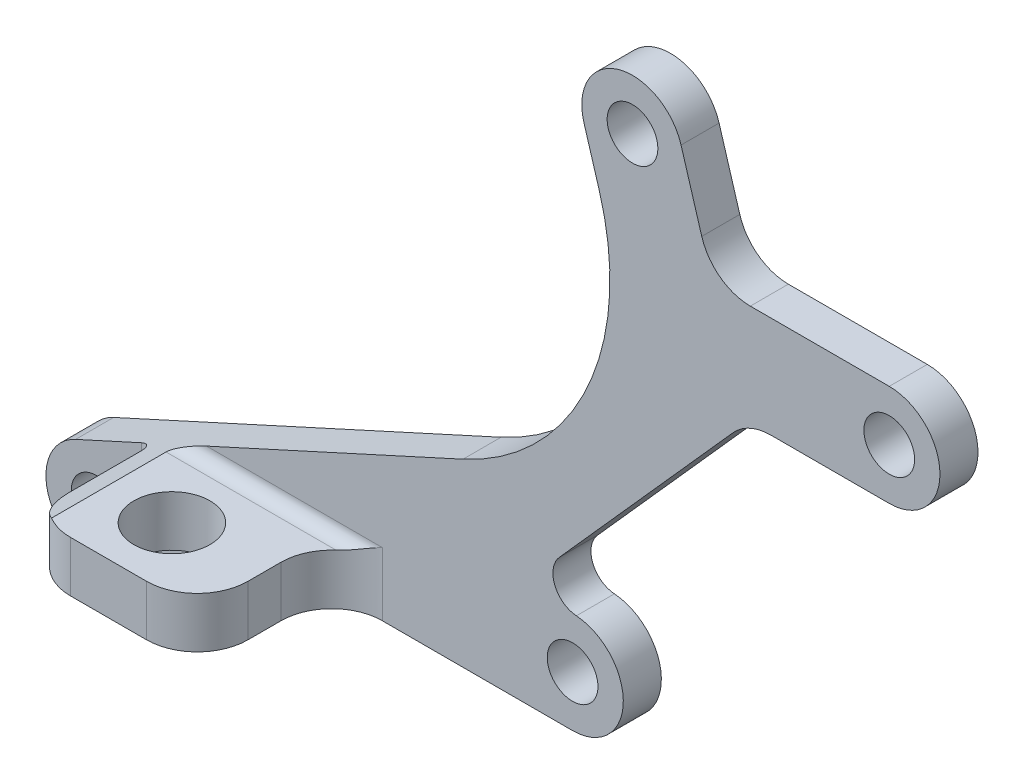
ISO-10303-21;
HEADER;
FILE_DESCRIPTION(('STEP AP214'),'2;1');
FILE_NAME('part.step','',(''),(''),'','','');
FILE_SCHEMA(('AUTOMOTIVE_DESIGN { 1 0 10303 214 1 1 1 1 }'));
ENDSEC;
DATA;
#1=APPLICATION_CONTEXT('core data for automotive mechanical design processes');
#2=APPLICATION_PROTOCOL_DEFINITION('international standard','automotive_design',2000,#1);
#3=PRODUCT_CONTEXT('',#1,'mechanical');
#4=PRODUCT('Part','Part','',(#3));
#5=PRODUCT_RELATED_PRODUCT_CATEGORY('part','',(#4));
#6=PRODUCT_DEFINITION_FORMATION('','',#4);
#7=PRODUCT_DEFINITION_CONTEXT('part definition',#1,'design');
#8=PRODUCT_DEFINITION('design','',#6,#7);
#9=PRODUCT_DEFINITION_SHAPE('','',#8);
#10=(LENGTH_UNIT() NAMED_UNIT(*) SI_UNIT(.MILLI.,.METRE.));
#11=(NAMED_UNIT(*) PLANE_ANGLE_UNIT() SI_UNIT($,.RADIAN.));
#12=(NAMED_UNIT(*) SI_UNIT($,.STERADIAN.) SOLID_ANGLE_UNIT());
#13=UNCERTAINTY_MEASURE_WITH_UNIT(LENGTH_MEASURE(1.E-05),#10,'distance_accuracy_value','');
#14=(GEOMETRIC_REPRESENTATION_CONTEXT(3) GLOBAL_UNCERTAINTY_ASSIGNED_CONTEXT((#13)) GLOBAL_UNIT_ASSIGNED_CONTEXT((#10,
#11,#12)) REPRESENTATION_CONTEXT('',''));
#15=CARTESIAN_POINT('',(0.,0.,0.));
#16=DIRECTION('',(0.,0.,1.));
#17=DIRECTION('',(1.,0.,0.));
#18=AXIS2_PLACEMENT_3D('',#15,#16,#17);
#19=CARTESIAN_POINT('',(15.9999999876103,2.00058899142973,1.5));
#20=DIRECTION('',(0.,0.,1.));
#21=DIRECTION('',(1.,0.,0.));
#22=AXIS2_PLACEMENT_3D('',#19,#20,#21);
#23=PLANE('',#22);
#24=DIRECTION('',(-1.,0.,0.));
#25=VECTOR('',#24,1.);
#26=CARTESIAN_POINT('',(6.49999998761032,2.5,1.5));
#27=LINE('',#26,#25);
#28=CARTESIAN_POINT('',(1.56588374498278,2.5,1.5));
#29=VERTEX_POINT('',#28);
#30=CARTESIAN_POINT('',(8.49999998761032,2.5,1.5));
#31=VERTEX_POINT('',#30);
#32=EDGE_CURVE('E345',#29,#31,#27,.F.);
#33=ORIENTED_EDGE('',*,*,#32,.T.);
#34=DIRECTION('',(0.,1.,0.));
#35=VECTOR('',#34,1.);
#36=CARTESIAN_POINT('',(8.49999998761032,0.,1.5));
#37=LINE('',#36,#35);
#38=CARTESIAN_POINT('',(8.49999998761032,0.,1.5));
#39=VERTEX_POINT('',#38);
#40=EDGE_CURVE('E361',#31,#39,#37,.F.);
#41=ORIENTED_EDGE('',*,*,#40,.T.);
#42=DIRECTION('',(1.,0.,0.));
#43=VECTOR('',#42,1.);
#44=CARTESIAN_POINT('',(5.72587492170305,0.,1.5));
#45=LINE('',#44,#43);
#46=CARTESIAN_POINT('',(15.9999999876103,0.,1.5));
#47=VERTEX_POINT('',#46);
#48=EDGE_CURVE('E291',#39,#47,#45,.T.);
#49=ORIENTED_EDGE('',*,*,#48,.T.);
#50=CARTESIAN_POINT('',(15.9999999876103,2.00058899142973,1.5));
#51=DIRECTION('',(0.,0.,1.));
#52=DIRECTION('',(1.,0.,0.));
#53=AXIS2_PLACEMENT_3D('',#50,#51,#52);
#54=CIRCLE('',#53,2.00058899142973);
#55=CARTESIAN_POINT('',(16.1495989013334,3.99557683040087,1.5));
#56=VERTEX_POINT('',#55);
#57=EDGE_CURVE('E278',#47,#56,#54,.T.);
#58=ORIENTED_EDGE('',*,*,#57,.T.);
#59=CARTESIAN_POINT('',(16.2243763365607,4.99277707868645,1.5));
#60=DIRECTION('',(0.,0.,1.));
#61=DIRECTION('',(1.,0.,0.));
#62=AXIS2_PLACEMENT_3D('',#59,#60,#61);
#63=CIRCLE('',#62,1.);
#64=CARTESIAN_POINT('',(15.4780865704061,5.65839828097267,1.5));
#65=VERTEX_POINT('',#64);
#66=EDGE_CURVE('E342',#56,#65,#63,.F.);
#67=ORIENTED_EDGE('',*,*,#66,.T.);
#68=DIRECTION('',(0.66562120228622,0.746289766154572,0.));
#69=VECTOR('',#68,1.);
#70=CARTESIAN_POINT('',(13.9999998843631,4.00117798285946,1.5));
#71=LINE('',#70,#69);
#72=CARTESIAN_POINT('',(22.3226020019824,13.3324203874319,1.5));
#73=VERTEX_POINT('',#72);
#74=EDGE_CURVE('E282',#65,#73,#71,.T.);
#75=ORIENTED_EDGE('',*,*,#74,.T.);
#76=CARTESIAN_POINT('',(23.8151815342915,12.0011779828595,1.5));
#77=DIRECTION('',(0.,0.,1.));
#78=DIRECTION('',(1.,0.,0.));
#79=AXIS2_PLACEMENT_3D('',#76,#77,#78);
#80=CIRCLE('',#79,2.);
#81=CARTESIAN_POINT('',(23.8151815342915,14.0011779828595,1.5));
#82=VERTEX_POINT('',#81);
#83=EDGE_CURVE('E329',#73,#82,#80,.F.);
#84=ORIENTED_EDGE('',*,*,#83,.T.);
#85=DIRECTION('',(1.,0.,0.));
#86=VECTOR('',#85,1.);
#87=CARTESIAN_POINT('',(22.9190717043612,14.0011779828595,1.5));
#88=LINE('',#87,#86);
#89=CARTESIAN_POINT('',(28.487225861294,14.0011779828595,1.5));
#90=VERTEX_POINT('',#89);
#91=EDGE_CURVE('E482',#82,#90,#88,.T.);
#92=ORIENTED_EDGE('',*,*,#91,.T.);
#93=CARTESIAN_POINT('',(28.487225861294,16.0011779828595,1.5));
#94=DIRECTION('',(0.,0.,1.));
#95=DIRECTION('',(1.,0.,0.));
#96=AXIS2_PLACEMENT_3D('',#93,#94,#95);
#97=CIRCLE('',#96,2.);
#98=CARTESIAN_POINT('',(28.487225861294,18.0011779828595,1.5));
#99=VERTEX_POINT('',#98);
#100=EDGE_CURVE('E484',#90,#99,#97,.T.);
#101=ORIENTED_EDGE('',*,*,#100,.T.);
#102=DIRECTION('',(-1.,0.,0.));
#103=VECTOR('',#102,1.);
#104=CARTESIAN_POINT('',(28.487225861294,18.0011779828595,1.5));
#105=LINE('',#104,#103);
#106=CARTESIAN_POINT('',(23.0090000463873,18.0011779828595,1.5));
#107=VERTEX_POINT('',#106);
#108=EDGE_CURVE('E489',#99,#107,#105,.T.);
#109=ORIENTED_EDGE('',*,*,#108,.T.);
#110=CARTESIAN_POINT('',(23.0090000463873,20.0011779828595,1.5));
#111=DIRECTION('',(0.,0.,1.));
#112=DIRECTION('',(1.,0.,0.));
#113=AXIS2_PLACEMENT_3D('',#110,#111,#112);
#114=CIRCLE('',#113,2.);
#115=CARTESIAN_POINT('',(21.093764126648,19.425095200839,1.5));
#116=VERTEX_POINT('',#115);
#117=EDGE_CURVE('E333',#107,#116,#114,.F.);
#118=ORIENTED_EDGE('',*,*,#117,.T.);
#119=DIRECTION('',(-0.288041391010258,0.957617959869632,0.));
#120=VECTOR('',#119,1.);
#121=CARTESIAN_POINT('',(20.2779497060594,22.1373392236034,1.5));
#122=LINE('',#121,#120);
#123=CARTESIAN_POINT('',(20.2779497060594,22.1373392236034,1.5));
#124=VERTEX_POINT('',#123);
#125=EDGE_CURVE('E492',#116,#124,#122,.T.);
#126=ORIENTED_EDGE('',*,*,#125,.T.);
#127=CARTESIAN_POINT('',(18.3627137863201,21.5612564415828,1.5));
#128=DIRECTION('',(0.,0.,1.));
#129=DIRECTION('',(1.,0.,0.));
#130=AXIS2_PLACEMENT_3D('',#127,#128,#129);
#131=CIRCLE('',#130,2.);
#132=CARTESIAN_POINT('',(16.4474778665809,20.9851736595623,1.5));
#133=VERTEX_POINT('',#132);
#134=EDGE_CURVE('E494',#124,#133,#131,.T.);
#135=ORIENTED_EDGE('',*,*,#134,.T.);
#136=DIRECTION('',(0.288041391010258,-0.957617959869632,0.));
#137=VECTOR('',#136,1.);
#138=CARTESIAN_POINT('',(17.0539428486444,18.968929546801,1.5));
#139=LINE('',#138,#137);
#140=CARTESIAN_POINT('',(17.0539428486444,18.968929546801,1.5));
#141=VERTEX_POINT('',#140);
#142=EDGE_CURVE('E496',#133,#141,#139,.T.);
#143=ORIENTED_EDGE('',*,*,#142,.T.);
#144=CARTESIAN_POINT('',(7.57352504593501,16.1173197757994,1.5));
#145=DIRECTION('',(0.,0.,-1.));
#146=DIRECTION('',(1.,0.,0.));
#147=AXIS2_PLACEMENT_3D('',#144,#145,#146);
#148=CIRCLE('',#147,9.9);
#149=CARTESIAN_POINT('',(11.678911431911,7.10866823287454,1.5));
#150=VERTEX_POINT('',#149);
#151=EDGE_CURVE('E498',#141,#150,#148,.T.);
#152=ORIENTED_EDGE('',*,*,#151,.T.);
#153=DIRECTION('',(-0.909964802315643,-0.414685493532933,0.));
#154=VECTOR('',#153,1.);
#155=CARTESIAN_POINT('',(-3.5973418353976,0.147035640748656,1.5));
#156=LINE('',#155,#154);
#157=EDGE_CURVE('E501',#150,#29,#156,.T.);
#158=ORIENTED_EDGE('',*,*,#157,.T.);
#159=EDGE_LOOP('',(#33,#41,#49,#58,#67,#75,#84,#92,#101,#109,#118,#126,#135,#143,#152,#158));
#160=FACE_BOUND('',#159,.T.);
#161=CARTESIAN_POINT('',(18.3627137863201,21.5612564415828,1.5));
#162=DIRECTION('',(0.,0.,1.));
#163=DIRECTION('',(1.,0.,0.));
#164=AXIS2_PLACEMENT_3D('',#161,#162,#163);
#165=CIRCLE('',#164,1.);
#166=CARTESIAN_POINT('',(19.3627137863201,21.5612564415828,1.5));
#167=VERTEX_POINT('',#166);
#168=EDGE_CURVE('E581',#167,#167,#165,.T.);
#169=ORIENTED_EDGE('',*,*,#168,.F.);
#170=EDGE_LOOP('',(#169));
#171=FACE_BOUND('',#170,.T.);
#172=CARTESIAN_POINT('',(28.487225861294,16.0011779828595,1.5));
#173=DIRECTION('',(0.,0.,1.));
#174=DIRECTION('',(1.,0.,0.));
#175=AXIS2_PLACEMENT_3D('',#172,#173,#174);
#176=CIRCLE('',#175,1.);
#177=CARTESIAN_POINT('',(29.487225861294,16.0011779828595,1.5));
#178=VERTEX_POINT('',#177);
#179=EDGE_CURVE('E593',#178,#178,#176,.T.);
#180=ORIENTED_EDGE('',*,*,#179,.F.);
#181=EDGE_LOOP('',(#180));
#182=FACE_BOUND('',#181,.T.);
#183=CARTESIAN_POINT('',(15.9999999876103,2.00058899142973,1.5));
#184=DIRECTION('',(0.,0.,1.));
#185=DIRECTION('',(1.,0.,0.));
#186=AXIS2_PLACEMENT_3D('',#183,#184,#185);
#187=CIRCLE('',#186,1.);
#188=CARTESIAN_POINT('',(16.9999999876103,2.00058899142973,1.5));
#189=VERTEX_POINT('',#188);
#190=EDGE_CURVE('E587',#189,#189,#187,.T.);
#191=ORIENTED_EDGE('',*,*,#190,.F.);
#192=EDGE_LOOP('',(#191));
#193=FACE_BOUND('',#192,.T.);
#194=ADVANCED_FACE('F33',(#160,#171,#182,#193),#23,.T.);
#195=DIRECTION('',(1.,0.,0.));
#196=VECTOR('',#195,1.);
#197=CARTESIAN_POINT('',(15.9999999876103,0.,1.5));
#198=LINE('',#197,#196);
#199=CARTESIAN_POINT('',(-1.00000001238968,0.,1.5));
#200=VERTEX_POINT('',#199);
#201=CARTESIAN_POINT('',(6.81145904615961,0.,1.5));
#202=VERTEX_POINT('',#201);
#203=EDGE_CURVE('E260',#200,#202,#198,.T.);
#204=ORIENTED_EDGE('',*,*,#203,.F.);
#205=DIRECTION('',(0.,-1.,0.));
#206=VECTOR('',#205,1.);
#207=CARTESIAN_POINT('',(-1.00000001238968,1.55854377737733,1.5));
#208=LINE('',#207,#206);
#209=CARTESIAN_POINT('',(-1.00000001238968,1.33068579183896,1.5));
#210=VERTEX_POINT('',#209);
#211=EDGE_CURVE('E352',#200,#210,#208,.F.);
#212=ORIENTED_EDGE('',*,*,#211,.T.);
#213=CARTESIAN_POINT('',(-3.5973418353976,0.147035640748653,1.5));
#214=VERTEX_POINT('',#213);
#215=EDGE_CURVE('E500',#210,#214,#156,.T.);
#216=ORIENTED_EDGE('',*,*,#215,.T.);
#217=CARTESIAN_POINT('',(-2.76797084833173,-1.67289396388264,1.5));
#218=DIRECTION('',(0.,0.,1.));
#219=DIRECTION('',(1.,0.,0.));
#220=AXIS2_PLACEMENT_3D('',#217,#218,#219);
#221=CIRCLE('',#220,2.);
#222=CARTESIAN_POINT('',(-1.93859986126587,-3.49282356851392,1.5));
#223=VERTEX_POINT('',#222);
#224=EDGE_CURVE('E504',#214,#223,#221,.T.);
#225=ORIENTED_EDGE('',*,*,#224,.T.);
#226=DIRECTION('',(0.909964802315643,0.414685493532933,0.));
#227=VECTOR('',#226,1.);
#228=CARTESIAN_POINT('',(-1.93859986126587,-3.49282356851392,1.5));
#229=LINE('',#228,#227);
#230=CARTESIAN_POINT('',(4.73803157849494,-0.450175988421784,1.5));
#231=VERTEX_POINT('',#230);
#232=EDGE_CURVE('E262',#223,#231,#229,.T.);
#233=ORIENTED_EDGE('',*,*,#232,.T.);
#234=CARTESIAN_POINT('',(6.81145904615961,-5.,1.5));
#235=DIRECTION('',(0.,0.,1.));
#236=DIRECTION('',(1.,0.,0.));
#237=AXIS2_PLACEMENT_3D('',#234,#235,#236);
#238=CIRCLE('',#237,5.);
#239=EDGE_CURVE('E41',#231,#202,#238,.F.);
#240=ORIENTED_EDGE('',*,*,#239,.T.);
#241=EDGE_LOOP('',(#204,#212,#216,#225,#233,#240));
#242=FACE_BOUND('',#241,.T.);
#243=CARTESIAN_POINT('',(-2.76797084833173,-1.67289396388264,1.5));
#244=DIRECTION('',(0.,0.,1.));
#245=DIRECTION('',(1.,0.,0.));
#246=AXIS2_PLACEMENT_3D('',#243,#244,#245);
#247=CIRCLE('',#246,1.);
#248=CARTESIAN_POINT('',(-1.76797084833173,-1.67289396388264,1.5));
#249=VERTEX_POINT('',#248);
#250=EDGE_CURVE('E510',#249,#249,#247,.T.);
#251=ORIENTED_EDGE('',*,*,#250,.F.);
#252=EDGE_LOOP('',(#251));
#253=FACE_BOUND('',#252,.T.);
#254=ADVANCED_FACE('F258',(#242,#253),#23,.T.);
#255=CARTESIAN_POINT('',(15.9999999876103,2.00058899142973,0.));
#256=DIRECTION('',(0.,0.,1.));
#257=DIRECTION('',(1.,0.,0.));
#258=AXIS2_PLACEMENT_3D('',#255,#256,#257);
#259=PLANE('',#258);
#260=CARTESIAN_POINT('',(-2.76797084833173,-1.67289396388264,0.));
#261=DIRECTION('',(0.,0.,1.));
#262=DIRECTION('',(1.,0.,0.));
#263=AXIS2_PLACEMENT_3D('',#260,#261,#262);
#264=CIRCLE('',#263,2.);
#265=CARTESIAN_POINT('',(-3.5973418353976,0.147035640748653,0.));
#266=VERTEX_POINT('',#265);
#267=CARTESIAN_POINT('',(-1.93859986126587,-3.49282356851392,0.));
#268=VERTEX_POINT('',#267);
#269=EDGE_CURVE('E284',#266,#268,#264,.T.);
#270=ORIENTED_EDGE('',*,*,#269,.F.);
#271=DIRECTION('',(-0.909964802315643,-0.414685493532933,0.));
#272=VECTOR('',#271,1.);
#273=CARTESIAN_POINT('',(-3.5973418353976,0.147035640748656,0.));
#274=LINE('',#273,#272);
#275=CARTESIAN_POINT('',(11.678911431911,7.10866823287454,0.));
#276=VERTEX_POINT('',#275);
#277=EDGE_CURVE('E527',#276,#266,#274,.T.);
#278=ORIENTED_EDGE('',*,*,#277,.F.);
#279=CARTESIAN_POINT('',(7.57352504593501,16.1173197757994,0.));
#280=DIRECTION('',(0.,0.,-1.));
#281=DIRECTION('',(1.,0.,0.));
#282=AXIS2_PLACEMENT_3D('',#279,#280,#281);
#283=CIRCLE('',#282,9.9);
#284=CARTESIAN_POINT('',(17.0539428486444,18.968929546801,0.));
#285=VERTEX_POINT('',#284);
#286=EDGE_CURVE('E525',#285,#276,#283,.T.);
#287=ORIENTED_EDGE('',*,*,#286,.F.);
#288=DIRECTION('',(0.288041391010258,-0.957617959869632,0.));
#289=VECTOR('',#288,1.);
#290=CARTESIAN_POINT('',(17.0539428486444,18.968929546801,0.));
#291=LINE('',#290,#289);
#292=CARTESIAN_POINT('',(16.4474778665809,20.9851736595623,0.));
#293=VERTEX_POINT('',#292);
#294=EDGE_CURVE('E523',#293,#285,#291,.T.);
#295=ORIENTED_EDGE('',*,*,#294,.F.);
#296=CARTESIAN_POINT('',(18.3627137863201,21.5612564415828,0.));
#297=DIRECTION('',(0.,0.,1.));
#298=DIRECTION('',(1.,0.,0.));
#299=AXIS2_PLACEMENT_3D('',#296,#297,#298);
#300=CIRCLE('',#299,2.);
#301=CARTESIAN_POINT('',(20.2779497060594,22.1373392236034,0.));
#302=VERTEX_POINT('',#301);
#303=EDGE_CURVE('E521',#302,#293,#300,.T.);
#304=ORIENTED_EDGE('',*,*,#303,.F.);
#305=DIRECTION('',(-0.288041391010258,0.957617959869632,0.));
#306=VECTOR('',#305,1.);
#307=CARTESIAN_POINT('',(20.2779497060594,22.1373392236034,0.));
#308=LINE('',#307,#306);
#309=CARTESIAN_POINT('',(21.093764126648,19.425095200839,0.));
#310=VERTEX_POINT('',#309);
#311=EDGE_CURVE('E519',#310,#302,#308,.T.);
#312=ORIENTED_EDGE('',*,*,#311,.F.);
#313=CARTESIAN_POINT('',(23.0090000463873,20.0011779828595,0.));
#314=DIRECTION('',(0.,0.,1.));
#315=DIRECTION('',(1.,0.,0.));
#316=AXIS2_PLACEMENT_3D('',#313,#314,#315);
#317=CIRCLE('',#316,2.);
#318=CARTESIAN_POINT('',(23.0090000463873,18.0011779828595,0.));
#319=VERTEX_POINT('',#318);
#320=EDGE_CURVE('E331',#310,#319,#317,.T.);
#321=ORIENTED_EDGE('',*,*,#320,.T.);
#322=DIRECTION('',(-1.,0.,0.));
#323=VECTOR('',#322,1.);
#324=CARTESIAN_POINT('',(28.487225861294,18.0011779828595,0.));
#325=LINE('',#324,#323);
#326=CARTESIAN_POINT('',(28.487225861294,18.0011779828595,0.));
#327=VERTEX_POINT('',#326);
#328=EDGE_CURVE('E516',#327,#319,#325,.T.);
#329=ORIENTED_EDGE('',*,*,#328,.F.);
#330=CARTESIAN_POINT('',(28.487225861294,16.0011779828595,0.));
#331=DIRECTION('',(0.,0.,1.));
#332=DIRECTION('',(1.,0.,0.));
#333=AXIS2_PLACEMENT_3D('',#330,#331,#332);
#334=CIRCLE('',#333,2.);
#335=CARTESIAN_POINT('',(28.487225861294,14.0011779828595,0.));
#336=VERTEX_POINT('',#335);
#337=EDGE_CURVE('E514',#336,#327,#334,.T.);
#338=ORIENTED_EDGE('',*,*,#337,.F.);
#339=DIRECTION('',(1.,0.,0.));
#340=VECTOR('',#339,1.);
#341=CARTESIAN_POINT('',(22.9190717043612,14.0011779828595,0.));
#342=LINE('',#341,#340);
#343=CARTESIAN_POINT('',(23.8151815342915,14.0011779828595,0.));
#344=VERTEX_POINT('',#343);
#345=EDGE_CURVE('E512',#344,#336,#342,.T.);
#346=ORIENTED_EDGE('',*,*,#345,.F.);
#347=CARTESIAN_POINT('',(23.8151815342915,12.0011779828595,0.));
#348=DIRECTION('',(0.,0.,1.));
#349=DIRECTION('',(1.,0.,0.));
#350=AXIS2_PLACEMENT_3D('',#347,#348,#349);
#351=CIRCLE('',#350,2.);
#352=CARTESIAN_POINT('',(22.3226020019824,13.3324203874319,0.));
#353=VERTEX_POINT('',#352);
#354=EDGE_CURVE('E326',#344,#353,#351,.T.);
#355=ORIENTED_EDGE('',*,*,#354,.T.);
#356=DIRECTION('',(0.66562120228622,0.746289766154572,0.));
#357=VECTOR('',#356,1.);
#358=CARTESIAN_POINT('',(13.9999998843631,4.00117798285946,0.));
#359=LINE('',#358,#357);
#360=CARTESIAN_POINT('',(15.4780865704061,5.65839828097267,0.));
#361=VERTEX_POINT('',#360);
#362=EDGE_CURVE('E509',#361,#353,#359,.T.);
#363=ORIENTED_EDGE('',*,*,#362,.F.);
#364=CARTESIAN_POINT('',(16.2243763365607,4.99277707868645,0.));
#365=DIRECTION('',(0.,0.,1.));
#366=DIRECTION('',(1.,0.,0.));
#367=AXIS2_PLACEMENT_3D('',#364,#365,#366);
#368=CIRCLE('',#367,1.);
#369=CARTESIAN_POINT('',(16.1495989013334,3.99557683040087,0.));
#370=VERTEX_POINT('',#369);
#371=EDGE_CURVE('E340',#361,#370,#368,.T.);
#372=ORIENTED_EDGE('',*,*,#371,.T.);
#373=CARTESIAN_POINT('',(15.9999999876103,2.00058899142973,0.));
#374=DIRECTION('',(0.,0.,1.));
#375=DIRECTION('',(1.,0.,0.));
#376=AXIS2_PLACEMENT_3D('',#373,#374,#375);
#377=CIRCLE('',#376,2.00058899142973);
#378=CARTESIAN_POINT('',(15.9999999876103,0.,0.));
#379=VERTEX_POINT('',#378);
#380=EDGE_CURVE('E277',#379,#370,#377,.T.);
#381=ORIENTED_EDGE('',*,*,#380,.F.);
#382=DIRECTION('',(1.,0.,0.));
#383=VECTOR('',#382,1.);
#384=CARTESIAN_POINT('',(5.72587492170305,0.,0.));
#385=LINE('',#384,#383);
#386=CARTESIAN_POINT('',(6.81145904615961,0.,0.));
#387=VERTEX_POINT('',#386);
#388=EDGE_CURVE('E268',#387,#379,#385,.T.);
#389=ORIENTED_EDGE('',*,*,#388,.F.);
#390=CARTESIAN_POINT('',(6.81145904615961,-5.,0.));
#391=DIRECTION('',(0.,0.,1.));
#392=DIRECTION('',(1.,0.,0.));
#393=AXIS2_PLACEMENT_3D('',#390,#391,#392);
#394=CIRCLE('',#393,5.);
#395=CARTESIAN_POINT('',(4.73803157849494,-0.450175988421784,0.));
#396=VERTEX_POINT('',#395);
#397=EDGE_CURVE('E253',#387,#396,#394,.T.);
#398=ORIENTED_EDGE('',*,*,#397,.T.);
#399=DIRECTION('',(0.909964802315643,0.414685493532933,0.));
#400=VECTOR('',#399,1.);
#401=CARTESIAN_POINT('',(-1.93859986126587,-3.49282356851392,0.));
#402=LINE('',#401,#400);
#403=EDGE_CURVE('E279',#268,#396,#402,.T.);
#404=ORIENTED_EDGE('',*,*,#403,.F.);
#405=EDGE_LOOP('',(#270,#278,#287,#295,#304,#312,#321,#329,#338,#346,#355,#363,#372,#381,#389,
#398,#404));
#406=FACE_BOUND('',#405,.T.);
#407=CARTESIAN_POINT('',(-2.76797084833173,-1.67289396388264,0.));
#408=DIRECTION('',(0.,0.,1.));
#409=DIRECTION('',(1.,0.,0.));
#410=AXIS2_PLACEMENT_3D('',#407,#408,#409);
#411=CIRCLE('',#410,1.);
#412=CARTESIAN_POINT('',(-1.76797084833173,-1.67289396388264,0.));
#413=VERTEX_POINT('',#412);
#414=EDGE_CURVE('E596',#413,#413,#411,.T.);
#415=ORIENTED_EDGE('',*,*,#414,.T.);
#416=EDGE_LOOP('',(#415));
#417=FACE_BOUND('',#416,.T.);
#418=CARTESIAN_POINT('',(18.3627137863201,21.5612564415828,0.));
#419=DIRECTION('',(0.,0.,1.));
#420=DIRECTION('',(1.,0.,0.));
#421=AXIS2_PLACEMENT_3D('',#418,#419,#420);
#422=CIRCLE('',#421,1.);
#423=CARTESIAN_POINT('',(19.3627137863201,21.5612564415828,0.));
#424=VERTEX_POINT('',#423);
#425=EDGE_CURVE('E580',#424,#424,#422,.T.);
#426=ORIENTED_EDGE('',*,*,#425,.T.);
#427=EDGE_LOOP('',(#426));
#428=FACE_BOUND('',#427,.T.);
#429=CARTESIAN_POINT('',(15.9999999876103,2.00058899142973,0.));
#430=DIRECTION('',(0.,0.,1.));
#431=DIRECTION('',(1.,0.,0.));
#432=AXIS2_PLACEMENT_3D('',#429,#430,#431);
#433=CIRCLE('',#432,1.);
#434=CARTESIAN_POINT('',(16.9999999876103,2.00058899142973,0.));
#435=VERTEX_POINT('',#434);
#436=EDGE_CURVE('E584',#435,#435,#433,.T.);
#437=ORIENTED_EDGE('',*,*,#436,.T.);
#438=EDGE_LOOP('',(#437));
#439=FACE_BOUND('',#438,.T.);
#440=CARTESIAN_POINT('',(28.487225861294,16.0011779828595,0.));
#441=DIRECTION('',(0.,0.,1.));
#442=DIRECTION('',(1.,0.,0.));
#443=AXIS2_PLACEMENT_3D('',#440,#441,#442);
#444=CIRCLE('',#443,1.);
#445=CARTESIAN_POINT('',(29.487225861294,16.0011779828595,0.));
#446=VERTEX_POINT('',#445);
#447=EDGE_CURVE('E590',#446,#446,#444,.T.);
#448=ORIENTED_EDGE('',*,*,#447,.T.);
#449=EDGE_LOOP('',(#448));
#450=FACE_BOUND('',#449,.T.);
#451=ADVANCED_FACE('F273',(#406,#417,#428,#439,#450),#259,.F.);
#452=CARTESIAN_POINT('',(15.9999999876103,2.00058899142973,1.5));
#453=DIRECTION('',(0.,0.,-1.));
#454=DIRECTION('',(-1.,0.,0.));
#455=AXIS2_PLACEMENT_3D('',#452,#453,#454);
#456=CYLINDRICAL_SURFACE('',#455,2.00058899142973);
#457=ORIENTED_EDGE('',*,*,#380,.T.);
#458=DIRECTION('',(0.,0.,-1.));
#459=VECTOR('',#458,1.);
#460=CARTESIAN_POINT('',(16.1495989013334,3.99557683040087,1.5));
#461=LINE('',#460,#459);
#462=EDGE_CURVE('E338',#370,#56,#461,.F.);
#463=ORIENTED_EDGE('',*,*,#462,.T.);
#464=ORIENTED_EDGE('',*,*,#57,.F.);
#465=DIRECTION('',(0.,0.,-1.));
#466=VECTOR('',#465,1.);
#467=CARTESIAN_POINT('',(15.9999999876103,0.,1.5));
#468=LINE('',#467,#466);
#469=EDGE_CURVE('E288',#47,#379,#468,.T.);
#470=ORIENTED_EDGE('',*,*,#469,.T.);
#471=EDGE_LOOP('',(#457,#463,#464,#470));
#472=FACE_BOUND('',#471,.T.);
#473=ADVANCED_FACE('F409',(#472),#456,.T.);
#474=CARTESIAN_POINT('',(13.9999998843631,4.00117798285946,1.5));
#475=DIRECTION('',(-0.746289766154572,0.66562120228622,0.));
#476=DIRECTION('',(-0.66562120228622,-0.746289766154572,0.));
#477=AXIS2_PLACEMENT_3D('',#474,#475,#476);
#478=PLANE('',#477);
#479=ORIENTED_EDGE('',*,*,#74,.F.);
#480=DIRECTION('',(0.,0.,1.));
#481=VECTOR('',#480,1.);
#482=CARTESIAN_POINT('',(15.4780865704061,5.65839828097267,0.));
#483=LINE('',#482,#481);
#484=EDGE_CURVE('E335',#65,#361,#483,.F.);
#485=ORIENTED_EDGE('',*,*,#484,.T.);
#486=ORIENTED_EDGE('',*,*,#362,.T.);
#487=DIRECTION('',(0.,0.,-1.));
#488=VECTOR('',#487,1.);
#489=CARTESIAN_POINT('',(22.3226020019824,13.3324203874319,1.5));
#490=LINE('',#489,#488);
#491=EDGE_CURVE('E318',#353,#73,#490,.F.);
#492=ORIENTED_EDGE('',*,*,#491,.T.);
#493=EDGE_LOOP('',(#479,#485,#486,#492));
#494=FACE_BOUND('',#493,.T.);
#495=ADVANCED_FACE('F449',(#494),#478,.F.);
#496=CARTESIAN_POINT('',(22.9190717043612,14.0011779828595,1.5));
#497=DIRECTION('',(0.,1.,0.));
#498=DIRECTION('',(0.,0.,1.));
#499=AXIS2_PLACEMENT_3D('',#496,#497,#498);
#500=PLANE('',#499);
#501=ORIENTED_EDGE('',*,*,#91,.F.);
#502=DIRECTION('',(0.,0.,-1.));
#503=VECTOR('',#502,1.);
#504=CARTESIAN_POINT('',(23.8151815342915,14.0011779828595,0.));
#505=LINE('',#504,#503);
#506=EDGE_CURVE('E315',#82,#344,#505,.T.);
#507=ORIENTED_EDGE('',*,*,#506,.T.);
#508=ORIENTED_EDGE('',*,*,#345,.T.);
#509=DIRECTION('',(0.,0.,-1.));
#510=VECTOR('',#509,1.);
#511=CARTESIAN_POINT('',(28.487225861294,14.0011779828595,1.5));
#512=LINE('',#511,#510);
#513=EDGE_CURVE('E312',#90,#336,#512,.T.);
#514=ORIENTED_EDGE('',*,*,#513,.F.);
#515=EDGE_LOOP('',(#501,#507,#508,#514));
#516=FACE_BOUND('',#515,.T.);
#517=ADVANCED_FACE('F445',(#516),#500,.F.);
#518=CARTESIAN_POINT('',(28.487225861294,16.0011779828595,1.5));
#519=DIRECTION('',(0.,0.,-1.));
#520=DIRECTION('',(-1.,0.,0.));
#521=AXIS2_PLACEMENT_3D('',#518,#519,#520);
#522=CYLINDRICAL_SURFACE('',#521,2.);
#523=ORIENTED_EDGE('',*,*,#337,.T.);
#524=DIRECTION('',(0.,0.,-1.));
#525=VECTOR('',#524,1.);
#526=CARTESIAN_POINT('',(28.487225861294,18.0011779828595,1.5));
#527=LINE('',#526,#525);
#528=EDGE_CURVE('E309',#99,#327,#527,.T.);
#529=ORIENTED_EDGE('',*,*,#528,.F.);
#530=ORIENTED_EDGE('',*,*,#100,.F.);
#531=ORIENTED_EDGE('',*,*,#513,.T.);
#532=EDGE_LOOP('',(#523,#529,#530,#531));
#533=FACE_BOUND('',#532,.T.);
#534=ADVANCED_FACE('F441',(#533),#522,.T.);
#535=CARTESIAN_POINT('',(28.487225861294,18.0011779828595,1.5));
#536=DIRECTION('',(0.,-1.,0.));
#537=DIRECTION('',(0.,0.,-1.));
#538=AXIS2_PLACEMENT_3D('',#535,#536,#537);
#539=PLANE('',#538);
#540=ORIENTED_EDGE('',*,*,#328,.T.);
#541=DIRECTION('',(0.,0.,-1.));
#542=VECTOR('',#541,1.);
#543=CARTESIAN_POINT('',(23.0090000463873,18.0011779828595,1.5));
#544=LINE('',#543,#542);
#545=EDGE_CURVE('E324',#319,#107,#544,.F.);
#546=ORIENTED_EDGE('',*,*,#545,.T.);
#547=ORIENTED_EDGE('',*,*,#108,.F.);
#548=ORIENTED_EDGE('',*,*,#528,.T.);
#549=EDGE_LOOP('',(#540,#546,#547,#548));
#550=FACE_BOUND('',#549,.T.);
#551=ADVANCED_FACE('F437',(#550),#539,.F.);
#552=CARTESIAN_POINT('',(20.2779497060594,22.1373392236034,1.5));
#553=DIRECTION('',(-0.957617959869632,-0.288041391010258,0.));
#554=DIRECTION('',(0.288041391010258,-0.957617959869632,0.));
#555=AXIS2_PLACEMENT_3D('',#552,#553,#554);
#556=PLANE('',#555);
#557=ORIENTED_EDGE('',*,*,#125,.F.);
#558=DIRECTION('',(0.,0.,-1.));
#559=VECTOR('',#558,1.);
#560=CARTESIAN_POINT('',(21.093764126648,19.425095200839,0.));
#561=LINE('',#560,#559);
#562=EDGE_CURVE('E321',#116,#310,#561,.T.);
#563=ORIENTED_EDGE('',*,*,#562,.T.);
#564=ORIENTED_EDGE('',*,*,#311,.T.);
#565=DIRECTION('',(0.,0.,-1.));
#566=VECTOR('',#565,1.);
#567=CARTESIAN_POINT('',(20.2779497060594,22.1373392236034,1.5));
#568=LINE('',#567,#566);
#569=EDGE_CURVE('E306',#124,#302,#568,.T.);
#570=ORIENTED_EDGE('',*,*,#569,.F.);
#571=EDGE_LOOP('',(#557,#563,#564,#570));
#572=FACE_BOUND('',#571,.T.);
#573=ADVANCED_FACE('F433',(#572),#556,.F.);
#574=CARTESIAN_POINT('',(18.3627137863201,21.5612564415828,1.5));
#575=DIRECTION('',(0.,0.,-1.));
#576=DIRECTION('',(-1.,0.,0.));
#577=AXIS2_PLACEMENT_3D('',#574,#575,#576);
#578=CYLINDRICAL_SURFACE('',#577,2.);
#579=ORIENTED_EDGE('',*,*,#303,.T.);
#580=DIRECTION('',(0.,0.,-1.));
#581=VECTOR('',#580,1.);
#582=CARTESIAN_POINT('',(16.4474778665809,20.9851736595623,1.5));
#583=LINE('',#582,#581);
#584=EDGE_CURVE('E303',#133,#293,#583,.T.);
#585=ORIENTED_EDGE('',*,*,#584,.F.);
#586=ORIENTED_EDGE('',*,*,#134,.F.);
#587=ORIENTED_EDGE('',*,*,#569,.T.);
#588=EDGE_LOOP('',(#579,#585,#586,#587));
#589=FACE_BOUND('',#588,.T.);
#590=ADVANCED_FACE('F429',(#589),#578,.T.);
#591=CARTESIAN_POINT('',(17.0539428486444,18.968929546801,1.5));
#592=DIRECTION('',(0.957617959869632,0.288041391010258,0.));
#593=DIRECTION('',(-0.288041391010258,0.957617959869632,0.));
#594=AXIS2_PLACEMENT_3D('',#591,#592,#593);
#595=PLANE('',#594);
#596=ORIENTED_EDGE('',*,*,#294,.T.);
#597=DIRECTION('',(0.,0.,-1.));
#598=VECTOR('',#597,1.);
#599=CARTESIAN_POINT('',(17.0539428486444,18.968929546801,1.5));
#600=LINE('',#599,#598);
#601=EDGE_CURVE('E300',#141,#285,#600,.T.);
#602=ORIENTED_EDGE('',*,*,#601,.F.);
#603=ORIENTED_EDGE('',*,*,#142,.F.);
#604=ORIENTED_EDGE('',*,*,#584,.T.);
#605=EDGE_LOOP('',(#596,#602,#603,#604));
#606=FACE_BOUND('',#605,.T.);
#607=ADVANCED_FACE('F425',(#606),#595,.F.);
#608=CARTESIAN_POINT('',(7.57352504593501,16.1173197757994,1.5));
#609=DIRECTION('',(0.,0.,-1.));
#610=DIRECTION('',(-1.,0.,0.));
#611=AXIS2_PLACEMENT_3D('',#608,#609,#610);
#612=CYLINDRICAL_SURFACE('',#611,9.9);
#613=ORIENTED_EDGE('',*,*,#286,.T.);
#614=DIRECTION('',(0.,0.,-1.));
#615=VECTOR('',#614,1.);
#616=CARTESIAN_POINT('',(11.678911431911,7.10866823287454,1.5));
#617=LINE('',#616,#615);
#618=EDGE_CURVE('E297',#150,#276,#617,.T.);
#619=ORIENTED_EDGE('',*,*,#618,.F.);
#620=ORIENTED_EDGE('',*,*,#151,.F.);
#621=ORIENTED_EDGE('',*,*,#601,.T.);
#622=EDGE_LOOP('',(#613,#619,#620,#621));
#623=FACE_BOUND('',#622,.T.);
#624=ADVANCED_FACE('F422',(#623),#612,.F.);
#625=CARTESIAN_POINT('',(-3.5973418353976,0.147035640748656,1.5));
#626=DIRECTION('',(0.414685493532933,-0.909964802315643,0.));
#627=DIRECTION('',(0.909964802315643,0.414685493532933,0.));
#628=AXIS2_PLACEMENT_3D('',#625,#626,#627);
#629=PLANE('',#628);
#630=ORIENTED_EDGE('',*,*,#215,.F.);
#631=CARTESIAN_POINT('',(-1.00000001238968,1.33068579183896,2.));
#632=DIRECTION('',(0.414685493532933,-0.909964802315643,0.));
#633=DIRECTION('',(0.909964802315643,0.414685493532933,0.));
#634=AXIS2_PLACEMENT_3D('',#631,#632,#633);
#635=ELLIPSE('',#634,0.549471802346222,0.5);
#636=CARTESIAN_POINT('',(-0.500000012389676,1.55854377737733,2.));
#637=VERTEX_POINT('',#636);
#638=EDGE_CURVE('E356',#210,#637,#635,.T.);
#639=ORIENTED_EDGE('',*,*,#638,.T.);
#640=DIRECTION('',(0.,0.,-1.));
#641=VECTOR('',#640,1.);
#642=CARTESIAN_POINT('',(-0.500000012389675,1.55854377737733,7.));
#643=LINE('',#642,#641);
#644=CARTESIAN_POINT('',(-0.500000012389676,1.55854377737733,4.8));
#645=VERTEX_POINT('',#644);
#646=EDGE_CURVE('E47',#645,#637,#643,.T.);
#647=ORIENTED_EDGE('',*,*,#646,.F.);
#648=CARTESIAN_POINT('',(1.49999998761032,2.46997571953083,4.8));
#649=DIRECTION('',(0.414685493532933,-0.909964802315643,0.));
#650=DIRECTION('',(0.909964802315643,0.414685493532933,0.));
#651=AXIS2_PLACEMENT_3D('',#648,#649,#650);
#652=ELLIPSE('',#651,2.19788720938489,2.);
#653=CARTESIAN_POINT('',(0.468709119264438,2.,6.51360413890326));
#654=VERTEX_POINT('',#653);
#655=EDGE_CURVE('E11',#645,#654,#652,.F.);
#656=ORIENTED_EDGE('',*,*,#655,.T.);
#657=DIRECTION('',(0.,0.,-1.));
#658=VECTOR('',#657,1.);
#659=CARTESIAN_POINT('',(0.468709119264438,2.,7.));
#660=LINE('',#659,#658);
#661=CARTESIAN_POINT('',(0.468709119264437,2.,2.));
#662=VERTEX_POINT('',#661);
#663=EDGE_CURVE('E213',#654,#662,#660,.T.);
#664=ORIENTED_EDGE('',*,*,#663,.T.);
#665=CARTESIAN_POINT('',(1.56588374498278,2.5,2.));
#666=DIRECTION('',(0.414685493532933,-0.909964802315643,0.));
#667=DIRECTION('',(0.909964802315643,0.414685493532933,0.));
#668=AXIS2_PLACEMENT_3D('',#665,#666,#667);
#669=ELLIPSE('',#668,1.205733038164,0.5);
#670=EDGE_CURVE('E347',#662,#29,#669,.T.);
#671=ORIENTED_EDGE('',*,*,#670,.T.);
#672=ORIENTED_EDGE('',*,*,#157,.F.);
#673=ORIENTED_EDGE('',*,*,#618,.T.);
#674=ORIENTED_EDGE('',*,*,#277,.T.);
#675=DIRECTION('',(0.,0.,-1.));
#676=VECTOR('',#675,1.);
#677=CARTESIAN_POINT('',(-3.5973418353976,0.147035640748653,1.5));
#678=LINE('',#677,#676);
#679=EDGE_CURVE('E294',#214,#266,#678,.T.);
#680=ORIENTED_EDGE('',*,*,#679,.F.);
#681=EDGE_LOOP('',(#630,#639,#647,#656,#664,#671,#672,#673,#674,#680));
#682=FACE_BOUND('',#681,.T.);
#683=ADVANCED_FACE('F212',(#682),#629,.F.);
#684=CARTESIAN_POINT('',(-2.76797084833173,-1.67289396388264,1.5));
#685=DIRECTION('',(0.,0.,-1.));
#686=DIRECTION('',(-1.,0.,0.));
#687=AXIS2_PLACEMENT_3D('',#684,#685,#686);
#688=CYLINDRICAL_SURFACE('',#687,2.);
#689=ORIENTED_EDGE('',*,*,#269,.T.);
#690=DIRECTION('',(0.,0.,-1.));
#691=VECTOR('',#690,1.);
#692=CARTESIAN_POINT('',(-1.93859986126587,-3.49282356851392,1.5));
#693=LINE('',#692,#691);
#694=EDGE_CURVE('E290',#223,#268,#693,.T.);
#695=ORIENTED_EDGE('',*,*,#694,.F.);
#696=ORIENTED_EDGE('',*,*,#224,.F.);
#697=ORIENTED_EDGE('',*,*,#679,.T.);
#698=EDGE_LOOP('',(#689,#695,#696,#697));
#699=FACE_BOUND('',#698,.T.);
#700=ADVANCED_FACE('F416',(#699),#688,.T.);
#701=CARTESIAN_POINT('',(-1.93859986126587,-3.49282356851392,1.5));
#702=DIRECTION('',(-0.414685493532933,0.909964802315643,0.));
#703=DIRECTION('',(-0.909964802315643,-0.414685493532933,0.));
#704=AXIS2_PLACEMENT_3D('',#701,#702,#703);
#705=PLANE('',#704);
#706=ORIENTED_EDGE('',*,*,#403,.T.);
#707=DIRECTION('',(0.,0.,-1.));
#708=VECTOR('',#707,1.);
#709=CARTESIAN_POINT('',(4.73803157849494,-0.450175988421783,1.5));
#710=LINE('',#709,#708);
#711=EDGE_CURVE('E55',#396,#231,#710,.F.);
#712=ORIENTED_EDGE('',*,*,#711,.T.);
#713=ORIENTED_EDGE('',*,*,#232,.F.);
#714=ORIENTED_EDGE('',*,*,#694,.T.);
#715=EDGE_LOOP('',(#706,#712,#713,#714));
#716=FACE_BOUND('',#715,.T.);
#717=ADVANCED_FACE('F412',(#716),#705,.F.);
#718=CARTESIAN_POINT('',(5.72587492170305,0.,1.5));
#719=DIRECTION('',(0.,1.,0.));
#720=DIRECTION('',(-1.,0.,0.));
#721=AXIS2_PLACEMENT_3D('',#718,#719,#720);
#722=PLANE('',#721);
#723=CARTESIAN_POINT('',(2.99999998761032,0.,4.3));
#724=DIRECTION('',(0.,1.,0.));
#725=DIRECTION('',(-1.,0.,0.));
#726=AXIS2_PLACEMENT_3D('',#723,#724,#725);
#727=CIRCLE('',#726,1.5);
#728=CARTESIAN_POINT('',(1.49999998761033,0.,4.3));
#729=VERTEX_POINT('',#728);
#730=EDGE_CURVE('E638',#729,#729,#727,.T.);
#731=ORIENTED_EDGE('',*,*,#730,.T.);
#732=EDGE_LOOP('',(#731));
#733=FACE_BOUND('',#732,.T.);
#734=ORIENTED_EDGE('',*,*,#203,.T.);
#735=DIRECTION('',(0.,0.,-1.));
#736=VECTOR('',#735,1.);
#737=CARTESIAN_POINT('',(6.81145904615961,0.,0.));
#738=LINE('',#737,#736);
#739=EDGE_CURVE('E249',#202,#387,#738,.T.);
#740=ORIENTED_EDGE('',*,*,#739,.T.);
#741=ORIENTED_EDGE('',*,*,#388,.T.);
#742=ORIENTED_EDGE('',*,*,#469,.F.);
#743=ORIENTED_EDGE('',*,*,#48,.F.);
#744=CARTESIAN_POINT('',(8.49999998761032,0.,3.5));
#745=DIRECTION('',(0.,1.,0.));
#746=DIRECTION('',(-1.,0.,0.));
#747=AXIS2_PLACEMENT_3D('',#744,#745,#746);
#748=CIRCLE('',#747,2.);
#749=CARTESIAN_POINT('',(6.49999998761032,0.,3.5));
#750=VERTEX_POINT('',#749);
#751=EDGE_CURVE('E374',#39,#750,#748,.T.);
#752=ORIENTED_EDGE('',*,*,#751,.T.);
#753=DIRECTION('',(0.,0.,-1.));
#754=VECTOR('',#753,1.);
#755=CARTESIAN_POINT('',(6.49999998761032,0.,6.8));
#756=LINE('',#755,#754);
#757=CARTESIAN_POINT('',(6.49999998761032,0.,4.8));
#758=VERTEX_POINT('',#757);
#759=EDGE_CURVE('E567',#758,#750,#756,.T.);
#760=ORIENTED_EDGE('',*,*,#759,.F.);
#761=CARTESIAN_POINT('',(4.49999998761032,0.,4.8));
#762=DIRECTION('',(0.,1.,0.));
#763=DIRECTION('',(-1.,0.,0.));
#764=AXIS2_PLACEMENT_3D('',#761,#762,#763);
#765=CIRCLE('',#764,2.);
#766=CARTESIAN_POINT('',(4.49999998761032,0.,6.8));
#767=VERTEX_POINT('',#766);
#768=EDGE_CURVE('E242',#758,#767,#765,.F.);
#769=ORIENTED_EDGE('',*,*,#768,.T.);
#770=DIRECTION('',(-1.,0.,0.));
#771=VECTOR('',#770,1.);
#772=CARTESIAN_POINT('',(6.49999998761032,0.,6.8));
#773=LINE('',#772,#771);
#774=CARTESIAN_POINT('',(1.49999998761032,0.,6.8));
#775=VERTEX_POINT('',#774);
#776=EDGE_CURVE('E575',#767,#775,#773,.T.);
#777=ORIENTED_EDGE('',*,*,#776,.T.);
#778=CARTESIAN_POINT('',(1.49999998761032,0.,4.8));
#779=DIRECTION('',(0.,1.,0.));
#780=DIRECTION('',(-1.,0.,0.));
#781=AXIS2_PLACEMENT_3D('',#778,#779,#780);
#782=CIRCLE('',#781,2.);
#783=CARTESIAN_POINT('',(-0.500000012389676,0.,4.8));
#784=VERTEX_POINT('',#783);
#785=EDGE_CURVE('E244',#775,#784,#782,.F.);
#786=ORIENTED_EDGE('',*,*,#785,.T.);
#787=DIRECTION('',(0.,0.,-1.));
#788=VECTOR('',#787,1.);
#789=CARTESIAN_POINT('',(-0.500000012389676,0.,6.8));
#790=LINE('',#789,#788);
#791=CARTESIAN_POINT('',(-0.500000012389676,0.,2.));
#792=VERTEX_POINT('',#791);
#793=EDGE_CURVE('E571',#784,#792,#790,.T.);
#794=ORIENTED_EDGE('',*,*,#793,.T.);
#795=CARTESIAN_POINT('',(-1.00000001238968,0.,2.));
#796=DIRECTION('',(0.,1.,0.));
#797=DIRECTION('',(-1.,0.,0.));
#798=AXIS2_PLACEMENT_3D('',#795,#796,#797);
#799=CIRCLE('',#798,0.5);
#800=EDGE_CURVE('E354',#792,#200,#799,.T.);
#801=ORIENTED_EDGE('',*,*,#800,.T.);
#802=EDGE_LOOP('',(#734,#740,#741,#742,#743,#752,#760,#769,#777,#786,#794,#801));
#803=FACE_BOUND('',#802,.T.);
#804=ADVANCED_FACE('F266',(#733,#803),#722,.F.);
#805=CARTESIAN_POINT('',(-2.76797084833173,-1.67289396388264,1.5));
#806=DIRECTION('',(0.,0.,-1.));
#807=DIRECTION('',(-1.,0.,0.));
#808=AXIS2_PLACEMENT_3D('',#805,#806,#807);
#809=CYLINDRICAL_SURFACE('',#808,1.);
#810=ORIENTED_EDGE('',*,*,#250,.T.);
#811=EDGE_LOOP('',(#810));
#812=FACE_BOUND('',#811,.T.);
#813=ORIENTED_EDGE('',*,*,#414,.F.);
#814=EDGE_LOOP('',(#813));
#815=FACE_BOUND('',#814,.T.);
#816=ADVANCED_FACE('F405',(#812,#815),#809,.F.);
#817=CARTESIAN_POINT('',(28.487225861294,16.0011779828595,1.5));
#818=DIRECTION('',(0.,0.,-1.));
#819=DIRECTION('',(-1.,0.,0.));
#820=AXIS2_PLACEMENT_3D('',#817,#818,#819);
#821=CYLINDRICAL_SURFACE('',#820,1.);
#822=ORIENTED_EDGE('',*,*,#179,.T.);
#823=EDGE_LOOP('',(#822));
#824=FACE_BOUND('',#823,.T.);
#825=ORIENTED_EDGE('',*,*,#447,.F.);
#826=EDGE_LOOP('',(#825));
#827=FACE_BOUND('',#826,.T.);
#828=ADVANCED_FACE('F605',(#824,#827),#821,.F.);
#829=CARTESIAN_POINT('',(15.9999999876103,2.00058899142973,1.5));
#830=DIRECTION('',(0.,0.,-1.));
#831=DIRECTION('',(-1.,0.,0.));
#832=AXIS2_PLACEMENT_3D('',#829,#830,#831);
#833=CYLINDRICAL_SURFACE('',#832,1.);
#834=ORIENTED_EDGE('',*,*,#190,.T.);
#835=EDGE_LOOP('',(#834));
#836=FACE_BOUND('',#835,.T.);
#837=ORIENTED_EDGE('',*,*,#436,.F.);
#838=EDGE_LOOP('',(#837));
#839=FACE_BOUND('',#838,.T.);
#840=ADVANCED_FACE('F610',(#836,#839),#833,.F.);
#841=CARTESIAN_POINT('',(18.3627137863201,21.5612564415828,1.5));
#842=DIRECTION('',(0.,0.,-1.));
#843=DIRECTION('',(-1.,0.,0.));
#844=AXIS2_PLACEMENT_3D('',#841,#842,#843);
#845=CYLINDRICAL_SURFACE('',#844,1.);
#846=ORIENTED_EDGE('',*,*,#168,.T.);
#847=EDGE_LOOP('',(#846));
#848=FACE_BOUND('',#847,.T.);
#849=ORIENTED_EDGE('',*,*,#425,.F.);
#850=EDGE_LOOP('',(#849));
#851=FACE_BOUND('',#850,.T.);
#852=ADVANCED_FACE('F461',(#848,#851),#845,.F.);
#853=CARTESIAN_POINT('',(23.8151815342915,12.0011779828595,1.5));
#854=DIRECTION('',(0.,0.,1.));
#855=DIRECTION('',(1.,0.,0.));
#856=AXIS2_PLACEMENT_3D('',#853,#854,#855);
#857=CYLINDRICAL_SURFACE('',#856,2.);
#858=ORIENTED_EDGE('',*,*,#83,.F.);
#859=ORIENTED_EDGE('',*,*,#491,.F.);
#860=ORIENTED_EDGE('',*,*,#354,.F.);
#861=ORIENTED_EDGE('',*,*,#506,.F.);
#862=EDGE_LOOP('',(#858,#859,#860,#861));
#863=FACE_BOUND('',#862,.T.);
#864=ADVANCED_FACE('F457',(#863),#857,.F.);
#865=CARTESIAN_POINT('',(23.0090000463873,20.0011779828595,1.5));
#866=DIRECTION('',(0.,0.,1.));
#867=DIRECTION('',(1.,0.,0.));
#868=AXIS2_PLACEMENT_3D('',#865,#866,#867);
#869=CYLINDRICAL_SURFACE('',#868,2.);
#870=ORIENTED_EDGE('',*,*,#117,.F.);
#871=ORIENTED_EDGE('',*,*,#545,.F.);
#872=ORIENTED_EDGE('',*,*,#320,.F.);
#873=ORIENTED_EDGE('',*,*,#562,.F.);
#874=EDGE_LOOP('',(#870,#871,#872,#873));
#875=FACE_BOUND('',#874,.T.);
#876=ADVANCED_FACE('F460',(#875),#869,.F.);
#877=CARTESIAN_POINT('',(16.2243763365607,4.99277707868645,1.5));
#878=DIRECTION('',(0.,0.,-1.));
#879=DIRECTION('',(-1.,0.,0.));
#880=AXIS2_PLACEMENT_3D('',#877,#878,#879);
#881=CYLINDRICAL_SURFACE('',#880,1.);
#882=ORIENTED_EDGE('',*,*,#66,.F.);
#883=ORIENTED_EDGE('',*,*,#462,.F.);
#884=ORIENTED_EDGE('',*,*,#371,.F.);
#885=ORIENTED_EDGE('',*,*,#484,.F.);
#886=EDGE_LOOP('',(#882,#883,#884,#885));
#887=FACE_BOUND('',#886,.T.);
#888=ADVANCED_FACE('F464',(#887),#881,.F.);
#889=CARTESIAN_POINT('',(6.49999998761032,0.,6.8));
#890=DIRECTION('',(1.,0.,0.));
#891=DIRECTION('',(0.,0.,-1.));
#892=AXIS2_PLACEMENT_3D('',#889,#890,#891);
#893=PLANE('',#892);
#894=DIRECTION('',(0.,0.,-1.));
#895=VECTOR('',#894,1.);
#896=CARTESIAN_POINT('',(6.49999998761032,2.,6.8));
#897=LINE('',#896,#895);
#898=CARTESIAN_POINT('',(6.49999998761032,2.,4.8));
#899=VERTEX_POINT('',#898);
#900=CARTESIAN_POINT('',(6.49999998761032,2.,3.5));
#901=VERTEX_POINT('',#900);
#902=EDGE_CURVE('E569',#899,#901,#897,.T.);
#903=ORIENTED_EDGE('',*,*,#902,.F.);
#904=DIRECTION('',(0.,-1.,0.));
#905=VECTOR('',#904,1.);
#906=CARTESIAN_POINT('',(6.49999998761032,0.,4.8));
#907=LINE('',#906,#905);
#908=EDGE_CURVE('E246',#899,#758,#907,.T.);
#909=ORIENTED_EDGE('',*,*,#908,.T.);
#910=ORIENTED_EDGE('',*,*,#759,.T.);
#911=DIRECTION('',(0.,1.,0.));
#912=VECTOR('',#911,1.);
#913=CARTESIAN_POINT('',(6.49999998761032,2.5,3.5));
#914=LINE('',#913,#912);
#915=EDGE_CURVE('E358',#750,#901,#914,.T.);
#916=ORIENTED_EDGE('',*,*,#915,.T.);
#917=EDGE_LOOP('',(#903,#909,#910,#916));
#918=FACE_BOUND('',#917,.T.);
#919=ADVANCED_FACE('F467',(#918),#893,.T.);
#920=CARTESIAN_POINT('',(6.49999998761032,2.,6.8));
#921=DIRECTION('',(0.,1.,0.));
#922=DIRECTION('',(0.,0.,1.));
#923=AXIS2_PLACEMENT_3D('',#920,#921,#922);
#924=PLANE('',#923);
#925=ORIENTED_EDGE('',*,*,#663,.F.);
#926=CARTESIAN_POINT('',(1.49999998761032,2.,4.8));
#927=DIRECTION('',(0.,1.,0.));
#928=DIRECTION('',(0.,0.,1.));
#929=AXIS2_PLACEMENT_3D('',#926,#927,#928);
#930=CIRCLE('',#929,2.);
#931=CARTESIAN_POINT('',(1.49999998761032,2.,6.8));
#932=VERTEX_POINT('',#931);
#933=EDGE_CURVE('E224',#654,#932,#930,.T.);
#934=ORIENTED_EDGE('',*,*,#933,.T.);
#935=DIRECTION('',(1.,0.,0.));
#936=VECTOR('',#935,1.);
#937=CARTESIAN_POINT('',(6.49999998761032,2.,6.8));
#938=LINE('',#937,#936);
#939=CARTESIAN_POINT('',(4.49999998761032,2.,6.8));
#940=VERTEX_POINT('',#939);
#941=EDGE_CURVE('E572',#932,#940,#938,.T.);
#942=ORIENTED_EDGE('',*,*,#941,.T.);
#943=CARTESIAN_POINT('',(4.49999998761032,2.,4.8));
#944=DIRECTION('',(0.,1.,0.));
#945=DIRECTION('',(0.,0.,1.));
#946=AXIS2_PLACEMENT_3D('',#943,#944,#945);
#947=CIRCLE('',#946,2.);
#948=EDGE_CURVE('E234',#940,#899,#947,.T.);
#949=ORIENTED_EDGE('',*,*,#948,.T.);
#950=ORIENTED_EDGE('',*,*,#902,.T.);
#951=CARTESIAN_POINT('',(8.49999998761032,2.,3.5));
#952=DIRECTION('',(0.,1.,0.));
#953=DIRECTION('',(0.,0.,1.));
#954=AXIS2_PLACEMENT_3D('',#951,#952,#953);
#955=CIRCLE('',#954,2.);
#956=CARTESIAN_POINT('',(7.17712433207803,2.,2.));
#957=VERTEX_POINT('',#956);
#958=EDGE_CURVE('E363',#901,#957,#955,.F.);
#959=ORIENTED_EDGE('',*,*,#958,.T.);
#960=DIRECTION('',(-1.,0.,0.));
#961=VECTOR('',#960,1.);
#962=CARTESIAN_POINT('',(0.468709119264437,2.,2.));
#963=LINE('',#962,#961);
#964=EDGE_CURVE('E227',#957,#662,#963,.T.);
#965=ORIENTED_EDGE('',*,*,#964,.T.);
#966=EDGE_LOOP('',(#925,#934,#942,#949,#950,#959,#965));
#967=FACE_BOUND('',#966,.T.);
#968=CARTESIAN_POINT('',(2.99999998761032,2.,4.3));
#969=DIRECTION('',(0.,1.,0.));
#970=DIRECTION('',(0.,0.,1.));
#971=AXIS2_PLACEMENT_3D('',#968,#969,#970);
#972=CIRCLE('',#971,1.5);
#973=CARTESIAN_POINT('',(2.99999998761032,2.,5.8));
#974=VERTEX_POINT('',#973);
#975=EDGE_CURVE('E641',#974,#974,#972,.T.);
#976=ORIENTED_EDGE('',*,*,#975,.F.);
#977=EDGE_LOOP('',(#976));
#978=FACE_BOUND('',#977,.T.);
#979=ADVANCED_FACE('F221',(#967,#978),#924,.T.);
#980=CARTESIAN_POINT('',(-0.500000012389676,0.,6.8));
#981=DIRECTION('',(-1.,0.,0.));
#982=DIRECTION('',(0.,0.,1.));
#983=AXIS2_PLACEMENT_3D('',#980,#981,#982);
#984=PLANE('',#983);
#985=ORIENTED_EDGE('',*,*,#646,.T.);
#986=DIRECTION('',(0.,-1.,0.));
#987=VECTOR('',#986,1.);
#988=CARTESIAN_POINT('',(-0.500000012389676,0.,2.));
#989=LINE('',#988,#987);
#990=EDGE_CURVE('E349',#637,#792,#989,.T.);
#991=ORIENTED_EDGE('',*,*,#990,.T.);
#992=ORIENTED_EDGE('',*,*,#793,.F.);
#993=DIRECTION('',(0.,1.,0.));
#994=VECTOR('',#993,1.);
#995=CARTESIAN_POINT('',(-0.500000012389676,0.,4.8));
#996=LINE('',#995,#994);
#997=EDGE_CURVE('E237',#784,#645,#996,.T.);
#998=ORIENTED_EDGE('',*,*,#997,.T.);
#999=EDGE_LOOP('',(#985,#991,#992,#998));
#1000=FACE_BOUND('',#999,.T.);
#1001=ADVANCED_FACE('F623',(#1000),#984,.T.);
#1002=CARTESIAN_POINT('',(0.,0.,6.8));
#1003=DIRECTION('',(0.,0.,1.));
#1004=DIRECTION('',(1.,0.,0.));
#1005=AXIS2_PLACEMENT_3D('',#1002,#1003,#1004);
#1006=PLANE('',#1005);
#1007=ORIENTED_EDGE('',*,*,#941,.F.);
#1008=DIRECTION('',(0.,1.,0.));
#1009=VECTOR('',#1008,1.);
#1010=CARTESIAN_POINT('',(1.49999998761032,0.,6.8));
#1011=LINE('',#1010,#1009);
#1012=EDGE_CURVE('E232',#932,#775,#1011,.F.);
#1013=ORIENTED_EDGE('',*,*,#1012,.T.);
#1014=ORIENTED_EDGE('',*,*,#776,.F.);
#1015=DIRECTION('',(0.,-1.,0.));
#1016=VECTOR('',#1015,1.);
#1017=CARTESIAN_POINT('',(4.49999998761032,0.,6.8));
#1018=LINE('',#1017,#1016);
#1019=EDGE_CURVE('E233',#767,#940,#1018,.F.);
#1020=ORIENTED_EDGE('',*,*,#1019,.T.);
#1021=EDGE_LOOP('',(#1007,#1013,#1014,#1020));
#1022=FACE_BOUND('',#1021,.T.);
#1023=ADVANCED_FACE('F626',(#1022),#1006,.T.);
#1024=CARTESIAN_POINT('',(6.49999998761032,2.5,2.));
#1025=DIRECTION('',(1.,0.,0.));
#1026=DIRECTION('',(0.,0.,-1.));
#1027=AXIS2_PLACEMENT_3D('',#1024,#1025,#1026);
#1028=CYLINDRICAL_SURFACE('',#1027,0.5);
#1029=ORIENTED_EDGE('',*,*,#964,.F.);
#1030=CARTESIAN_POINT('',(7.17712433207803,2.,2.));
#1031=CARTESIAN_POINT('',(7.20154723341742,2.00001041146748,1.97845644742904));
#1032=CARTESIAN_POINT('',(7.22646937124254,2.00139028328963,1.95754258581726));
#1033=CARTESIAN_POINT('',(7.27710744095635,2.00649832439411,1.91709800973595));
#1034=CARTESIAN_POINT('',(7.30282175892259,2.01022198524383,1.89756471970191));
#1035=CARTESIAN_POINT('',(7.38055502764567,2.0242553324765,1.84141500342928));
#1036=CARTESIAN_POINT('',(7.43357718032034,2.03744074350753,1.80688662641144));
#1037=CARTESIAN_POINT('',(7.5293772906009,2.06574389704176,1.75063867289124));
#1038=CARTESIAN_POINT('',(7.57182849311403,2.07978997791442,1.72777495053326));
#1039=CARTESIAN_POINT('',(7.65751906107804,2.11044334270582,1.68547303643089));
#1040=CARTESIAN_POINT('',(7.70075874424337,2.1270516801234,1.66603626078771));
#1041=CARTESIAN_POINT('',(7.83174101371281,2.17994999938814,1.6125802028338));
#1042=CARTESIAN_POINT('',(7.920389118755,2.21919775960501,1.583621786334));
#1043=CARTESIAN_POINT('',(8.08949838060548,2.29762139815223,1.54084383470573));
#1044=CARTESIAN_POINT('',(8.16985261689535,2.33638060742809,1.52576347472202));
#1045=CARTESIAN_POINT('',(8.3308262150279,2.41543353741686,1.50552407764715));
#1046=CARTESIAN_POINT('',(8.41144425670707,2.45572278625241,1.50033810271671));
#1047=CARTESIAN_POINT('',(8.4946667198519,2.49733336930445,1.5000053371165));
#1048=CARTESIAN_POINT('',(8.49733339338354,2.4986667062695,1.50000000442671));
#1049=CARTESIAN_POINT('',(8.49999998761032,2.5,1.5));
#1050=B_SPLINE_CURVE_WITH_KNOTS('',3,(#1030,#1031,#1032,#1033,#1034,#1035,#1036,#1037,#1038,
#1039,#1040,#1041,#1042,#1043,#1044,#1045,#1046,#1047,#1048,#1049),.UNSPECIFIED.,.F.,.F.,(4,2,2,
2,2,2,2,2,2,4),(0.,0.0975966634311874,0.195006164580564,0.388196470326694,0.538676093841782,
0.689217754352708,0.991572844675033,1.26249642313569,1.53268134341627,1.54162562963826),.UNSPECIFIED.);
#1051=EDGE_CURVE('E365',#957,#31,#1050,.T.);
#1052=ORIENTED_EDGE('',*,*,#1051,.T.);
#1053=ORIENTED_EDGE('',*,*,#32,.F.);
#1054=ORIENTED_EDGE('',*,*,#670,.F.);
#1055=EDGE_LOOP('',(#1029,#1052,#1053,#1054));
#1056=FACE_BOUND('',#1055,.T.);
#1057=ADVANCED_FACE('F375',(#1056),#1028,.F.);
#1058=CARTESIAN_POINT('',(-1.00000001238968,0.,2.));
#1059=DIRECTION('',(0.,1.,0.));
#1060=DIRECTION('',(0.,0.,1.));
#1061=AXIS2_PLACEMENT_3D('',#1058,#1059,#1060);
#1062=CYLINDRICAL_SURFACE('',#1061,0.5);
#1063=ORIENTED_EDGE('',*,*,#638,.F.);
#1064=ORIENTED_EDGE('',*,*,#211,.F.);
#1065=ORIENTED_EDGE('',*,*,#800,.F.);
#1066=ORIENTED_EDGE('',*,*,#990,.F.);
#1067=EDGE_LOOP('',(#1063,#1064,#1065,#1066));
#1068=FACE_BOUND('',#1067,.T.);
#1069=ADVANCED_FACE('F383',(#1068),#1062,.F.);
#1070=CARTESIAN_POINT('',(8.49999998761032,0.,3.5));
#1071=DIRECTION('',(0.,-1.,0.));
#1072=DIRECTION('',(0.,0.,-1.));
#1073=AXIS2_PLACEMENT_3D('',#1070,#1071,#1072);
#1074=CYLINDRICAL_SURFACE('',#1073,2.);
#1075=ORIENTED_EDGE('',*,*,#751,.F.);
#1076=ORIENTED_EDGE('',*,*,#40,.F.);
#1077=ORIENTED_EDGE('',*,*,#1051,.F.);
#1078=ORIENTED_EDGE('',*,*,#958,.F.);
#1079=ORIENTED_EDGE('',*,*,#915,.F.);
#1080=EDGE_LOOP('',(#1075,#1076,#1077,#1078,#1079));
#1081=FACE_BOUND('',#1080,.T.);
#1082=ADVANCED_FACE('F379',(#1081),#1074,.F.);
#1083=CARTESIAN_POINT('',(1.49999998761032,0.,4.8));
#1084=DIRECTION('',(0.,1.,0.));
#1085=DIRECTION('',(0.,0.,1.));
#1086=AXIS2_PLACEMENT_3D('',#1083,#1084,#1085);
#1087=CYLINDRICAL_SURFACE('',#1086,2.);
#1088=ORIENTED_EDGE('',*,*,#655,.F.);
#1089=ORIENTED_EDGE('',*,*,#997,.F.);
#1090=ORIENTED_EDGE('',*,*,#785,.F.);
#1091=ORIENTED_EDGE('',*,*,#1012,.F.);
#1092=ORIENTED_EDGE('',*,*,#933,.F.);
#1093=EDGE_LOOP('',(#1088,#1089,#1090,#1091,#1092));
#1094=FACE_BOUND('',#1093,.T.);
#1095=ADVANCED_FACE('F230',(#1094),#1087,.T.);
#1096=CARTESIAN_POINT('',(4.49999998761032,0.,4.8));
#1097=DIRECTION('',(0.,-1.,0.));
#1098=DIRECTION('',(0.,0.,-1.));
#1099=AXIS2_PLACEMENT_3D('',#1096,#1097,#1098);
#1100=CYLINDRICAL_SURFACE('',#1099,2.);
#1101=ORIENTED_EDGE('',*,*,#948,.F.);
#1102=ORIENTED_EDGE('',*,*,#1019,.F.);
#1103=ORIENTED_EDGE('',*,*,#768,.F.);
#1104=ORIENTED_EDGE('',*,*,#908,.F.);
#1105=EDGE_LOOP('',(#1101,#1102,#1103,#1104));
#1106=FACE_BOUND('',#1105,.T.);
#1107=ADVANCED_FACE('F386',(#1106),#1100,.T.);
#1108=CARTESIAN_POINT('',(2.99999998761032,-3.,4.3));
#1109=DIRECTION('',(0.,1.,0.));
#1110=DIRECTION('',(0.,0.,1.));
#1111=AXIS2_PLACEMENT_3D('',#1108,#1109,#1110);
#1112=CYLINDRICAL_SURFACE('',#1111,1.5);
#1113=ORIENTED_EDGE('',*,*,#975,.T.);
#1114=EDGE_LOOP('',(#1113));
#1115=FACE_BOUND('',#1114,.T.);
#1116=ORIENTED_EDGE('',*,*,#730,.F.);
#1117=EDGE_LOOP('',(#1116));
#1118=FACE_BOUND('',#1117,.T.);
#1119=ADVANCED_FACE('F388',(#1115,#1118),#1112,.F.);
#1120=CARTESIAN_POINT('',(6.81145904615961,-5.,1.5));
#1121=DIRECTION('',(0.,0.,1.));
#1122=DIRECTION('',(1.,0.,0.));
#1123=AXIS2_PLACEMENT_3D('',#1120,#1121,#1122);
#1124=CYLINDRICAL_SURFACE('',#1123,5.);
#1125=ORIENTED_EDGE('',*,*,#239,.F.);
#1126=ORIENTED_EDGE('',*,*,#711,.F.);
#1127=ORIENTED_EDGE('',*,*,#397,.F.);
#1128=ORIENTED_EDGE('',*,*,#739,.F.);
#1129=EDGE_LOOP('',(#1125,#1126,#1127,#1128));
#1130=FACE_BOUND('',#1129,.T.);
#1131=ADVANCED_FACE('F35',(#1130),#1124,.F.);
#1132=CLOSED_SHELL('',(#194,#254,#451,#473,#495,#517,#534,#551,#573,#590,#607,#624,#683,#700,
#717,#804,#816,#828,#840,#852,#864,#876,#888,#919,#979,#1001,#1023,#1057,#1069,#1082,#1095,
#1107,#1119,#1131));
#1133=MANIFOLD_SOLID_BREP('B2',#1132);
#1134=ADVANCED_BREP_SHAPE_REPRESENTATION('',(#18,#1133),#14);
#1135=SHAPE_DEFINITION_REPRESENTATION(#9,#1134);
ENDSEC;
END-ISO-10303-21;
